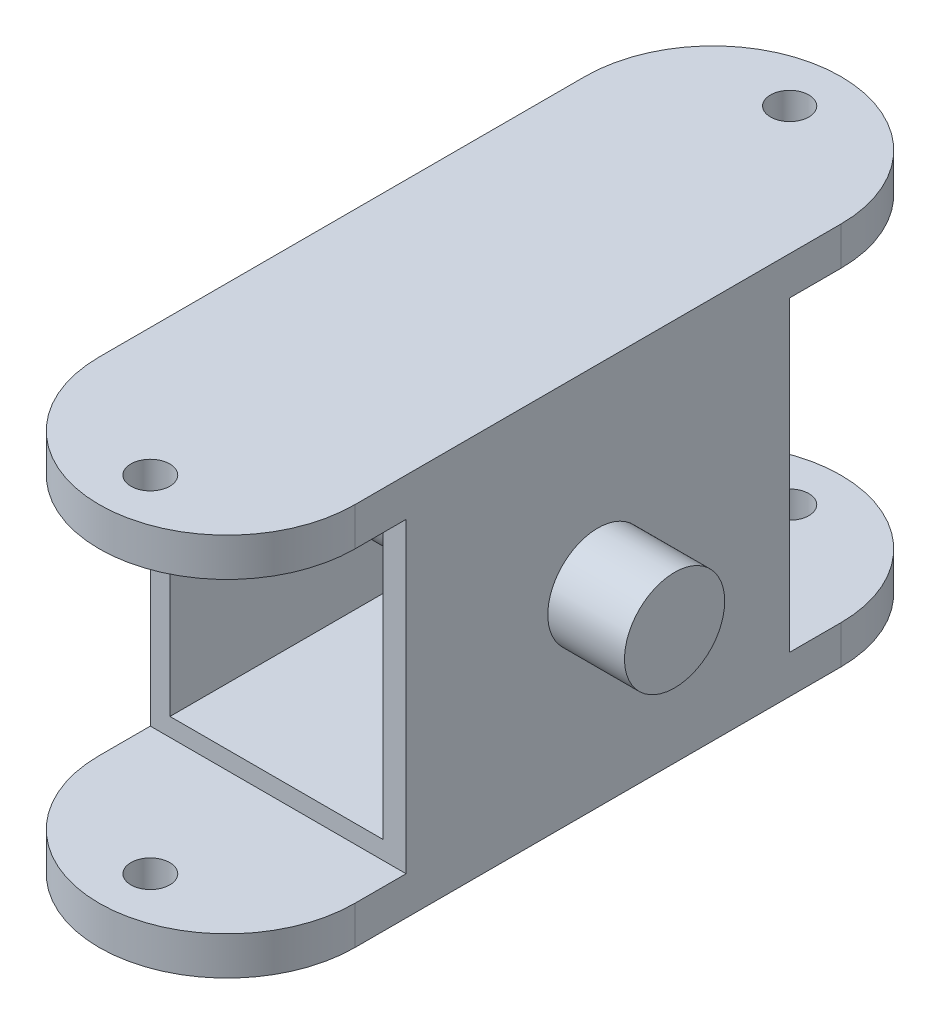
ISO-10303-21;
HEADER;
FILE_DESCRIPTION(('STEP AP214'),'2;1');
FILE_NAME('part.step','',(''),(''),'','','');
FILE_SCHEMA(('AUTOMOTIVE_DESIGN { 1 0 10303 214 1 1 1 1 }'));
ENDSEC;
DATA;
#1=APPLICATION_CONTEXT('core data for automotive mechanical design processes');
#2=APPLICATION_PROTOCOL_DEFINITION('international standard','automotive_design',2000,#1);
#3=PRODUCT_CONTEXT('',#1,'mechanical');
#4=PRODUCT('Part','Part','',(#3));
#5=PRODUCT_RELATED_PRODUCT_CATEGORY('part','',(#4));
#6=PRODUCT_DEFINITION_FORMATION('','',#4);
#7=PRODUCT_DEFINITION_CONTEXT('part definition',#1,'design');
#8=PRODUCT_DEFINITION('design','',#6,#7);
#9=PRODUCT_DEFINITION_SHAPE('','',#8);
#10=(LENGTH_UNIT() NAMED_UNIT(*) SI_UNIT(.MILLI.,.METRE.));
#11=(NAMED_UNIT(*) PLANE_ANGLE_UNIT() SI_UNIT($,.RADIAN.));
#12=(NAMED_UNIT(*) SI_UNIT($,.STERADIAN.) SOLID_ANGLE_UNIT());
#13=UNCERTAINTY_MEASURE_WITH_UNIT(LENGTH_MEASURE(1.E-05),#10,'distance_accuracy_value','');
#14=(GEOMETRIC_REPRESENTATION_CONTEXT(3) GLOBAL_UNCERTAINTY_ASSIGNED_CONTEXT((#13)) GLOBAL_UNIT_ASSIGNED_CONTEXT((#10,
#11,#12)) REPRESENTATION_CONTEXT('',''));
#15=CARTESIAN_POINT('',(0.,0.,0.));
#16=DIRECTION('',(0.,0.,1.));
#17=DIRECTION('',(1.,0.,0.));
#18=AXIS2_PLACEMENT_3D('',#15,#16,#17);
#19=CARTESIAN_POINT('',(0.,-7.5,-7.5));
#20=DIRECTION('',(0.,1.,0.));
#21=DIRECTION('',(0.,0.,1.));
#22=AXIS2_PLACEMENT_3D('',#19,#20,#21);
#23=PLANE('',#22);
#24=DIRECTION('',(0.,0.,-1.));
#25=VECTOR('',#24,1.);
#26=CARTESIAN_POINT('',(10.,-7.5,0.));
#27=LINE('',#26,#25);
#28=CARTESIAN_POINT('',(10.,-7.5,9.5));
#29=VERTEX_POINT('',#28);
#30=CARTESIAN_POINT('',(10.,-7.5,-9.5));
#31=VERTEX_POINT('',#30);
#32=EDGE_CURVE('E41',#29,#31,#27,.T.);
#33=ORIENTED_EDGE('',*,*,#32,.F.);
#34=CARTESIAN_POINT('',(5.,-7.5,9.5));
#35=DIRECTION('',(0.,1.,0.));
#36=DIRECTION('',(0.,0.,-1.));
#37=AXIS2_PLACEMENT_3D('',#34,#35,#36);
#38=CIRCLE('',#37,5.);
#39=CARTESIAN_POINT('',(0.,-7.5,9.5));
#40=VERTEX_POINT('',#39);
#41=EDGE_CURVE('E213',#40,#29,#38,.T.);
#42=ORIENTED_EDGE('',*,*,#41,.F.);
#43=DIRECTION('',(0.,0.,-1.));
#44=VECTOR('',#43,1.);
#45=CARTESIAN_POINT('',(0.,-7.5,0.));
#46=LINE('',#45,#44);
#47=CARTESIAN_POINT('',(0.,-7.5,-9.5));
#48=VERTEX_POINT('',#47);
#49=EDGE_CURVE('E184',#40,#48,#46,.T.);
#50=ORIENTED_EDGE('',*,*,#49,.T.);
#51=CARTESIAN_POINT('',(5.,-7.5,-9.5));
#52=DIRECTION('',(0.,1.,0.));
#53=DIRECTION('',(0.,0.,1.));
#54=AXIS2_PLACEMENT_3D('',#51,#52,#53);
#55=CIRCLE('',#54,5.);
#56=EDGE_CURVE('E246',#31,#48,#55,.T.);
#57=ORIENTED_EDGE('',*,*,#56,.F.);
#58=EDGE_LOOP('',(#33,#42,#50,#57));
#59=FACE_BOUND('',#58,.T.);
#60=CARTESIAN_POINT('',(5.,-7.5,12.5));
#61=DIRECTION('',(0.,1.,0.));
#62=DIRECTION('',(0.,0.,1.));
#63=AXIS2_PLACEMENT_3D('',#60,#61,#62);
#64=CIRCLE('',#63,0.759232067100159);
#65=CARTESIAN_POINT('',(5.,-7.5,13.2592320671002));
#66=VERTEX_POINT('',#65);
#67=EDGE_CURVE('E233',#66,#66,#64,.T.);
#68=ORIENTED_EDGE('',*,*,#67,.T.);
#69=EDGE_LOOP('',(#68));
#70=FACE_BOUND('',#69,.T.);
#71=CARTESIAN_POINT('',(5.,-7.5,-12.5));
#72=DIRECTION('',(0.,1.,0.));
#73=DIRECTION('',(0.,0.,1.));
#74=AXIS2_PLACEMENT_3D('',#71,#72,#73);
#75=CIRCLE('',#74,0.75);
#76=CARTESIAN_POINT('',(5.,-7.5,-11.75));
#77=VERTEX_POINT('',#76);
#78=EDGE_CURVE('E241',#77,#77,#75,.T.);
#79=ORIENTED_EDGE('',*,*,#78,.T.);
#80=EDGE_LOOP('',(#79));
#81=FACE_BOUND('',#80,.T.);
#82=ADVANCED_FACE('F33',(#59,#70,#81),#23,.F.);
#83=CARTESIAN_POINT('',(0.,-6.,-7.5));
#84=DIRECTION('',(0.,0.,-1.));
#85=DIRECTION('',(-1.,0.,0.));
#86=AXIS2_PLACEMENT_3D('',#83,#84,#85);
#87=PLANE('',#86);
#88=DIRECTION('',(0.,1.,0.));
#89=VECTOR('',#88,1.);
#90=CARTESIAN_POINT('',(0.768778211096725,-6.,-7.5));
#91=LINE('',#90,#89);
#92=CARTESIAN_POINT('',(0.768778211096725,-5.28902723612904,-7.5));
#93=VERTEX_POINT('',#92);
#94=CARTESIAN_POINT('',(0.768778211096725,5.26384139214758,-7.5));
#95=VERTEX_POINT('',#94);
#96=EDGE_CURVE('E179',#93,#95,#91,.T.);
#97=ORIENTED_EDGE('',*,*,#96,.F.);
#98=DIRECTION('',(-1.,0.,0.));
#99=VECTOR('',#98,1.);
#100=CARTESIAN_POINT('',(0.,-5.28902723612904,-7.5));
#101=LINE('',#100,#99);
#102=CARTESIAN_POINT('',(9.10529256899544,-5.28902723612904,-7.5));
#103=VERTEX_POINT('',#102);
#104=EDGE_CURVE('E172',#103,#93,#101,.T.);
#105=ORIENTED_EDGE('',*,*,#104,.F.);
#106=DIRECTION('',(0.,-1.,0.));
#107=VECTOR('',#106,1.);
#108=CARTESIAN_POINT('',(9.10529256899544,-6.,-7.5));
#109=LINE('',#108,#107);
#110=CARTESIAN_POINT('',(9.10529256899544,5.26384139214758,-7.5));
#111=VERTEX_POINT('',#110);
#112=EDGE_CURVE('E152',#111,#103,#109,.T.);
#113=ORIENTED_EDGE('',*,*,#112,.F.);
#114=DIRECTION('',(1.,0.,0.));
#115=VECTOR('',#114,1.);
#116=CARTESIAN_POINT('',(0.,5.26384139214758,-7.5));
#117=LINE('',#116,#115);
#118=EDGE_CURVE('E177',#95,#111,#117,.T.);
#119=ORIENTED_EDGE('',*,*,#118,.F.);
#120=EDGE_LOOP('',(#97,#105,#113,#119));
#121=FACE_BOUND('',#120,.T.);
#122=DIRECTION('',(0.,1.,0.));
#123=VECTOR('',#122,1.);
#124=CARTESIAN_POINT('',(10.,0.,-7.5));
#125=LINE('',#124,#123);
#126=CARTESIAN_POINT('',(10.,-6.,-7.5));
#127=VERTEX_POINT('',#126);
#128=CARTESIAN_POINT('',(10.,6.,-7.5));
#129=VERTEX_POINT('',#128);
#130=EDGE_CURVE('E183',#127,#129,#125,.T.);
#131=ORIENTED_EDGE('',*,*,#130,.F.);
#132=DIRECTION('',(1.,0.,0.));
#133=VECTOR('',#132,1.);
#134=CARTESIAN_POINT('',(5.,-6.,-7.5));
#135=LINE('',#134,#133);
#136=CARTESIAN_POINT('',(0.,-6.,-7.5));
#137=VERTEX_POINT('',#136);
#138=EDGE_CURVE('E191',#137,#127,#135,.T.);
#139=ORIENTED_EDGE('',*,*,#138,.F.);
#140=DIRECTION('',(0.,1.,0.));
#141=VECTOR('',#140,1.);
#142=CARTESIAN_POINT('',(0.,0.,-7.5));
#143=LINE('',#142,#141);
#144=CARTESIAN_POINT('',(0.,6.,-7.5));
#145=VERTEX_POINT('',#144);
#146=EDGE_CURVE('E196',#137,#145,#143,.T.);
#147=ORIENTED_EDGE('',*,*,#146,.T.);
#148=DIRECTION('',(1.,0.,0.));
#149=VECTOR('',#148,1.);
#150=CARTESIAN_POINT('',(5.,6.,-7.5));
#151=LINE('',#150,#149);
#152=EDGE_CURVE('E192',#145,#129,#151,.T.);
#153=ORIENTED_EDGE('',*,*,#152,.T.);
#154=EDGE_LOOP('',(#131,#139,#147,#153));
#155=FACE_BOUND('',#154,.T.);
#156=ADVANCED_FACE('F331',(#121,#155),#87,.T.);
#157=CARTESIAN_POINT('',(0.,7.5,-7.5));
#158=DIRECTION('',(0.,-1.,0.));
#159=DIRECTION('',(0.,0.,-1.));
#160=AXIS2_PLACEMENT_3D('',#157,#158,#159);
#161=PLANE('',#160);
#162=DIRECTION('',(0.,0.,1.));
#163=VECTOR('',#162,1.);
#164=CARTESIAN_POINT('',(10.,7.5,0.));
#165=LINE('',#164,#163);
#166=CARTESIAN_POINT('',(10.,7.5,-9.5));
#167=VERTEX_POINT('',#166);
#168=CARTESIAN_POINT('',(10.,7.5,9.5));
#169=VERTEX_POINT('',#168);
#170=EDGE_CURVE('E201',#167,#169,#165,.T.);
#171=ORIENTED_EDGE('',*,*,#170,.F.);
#172=CARTESIAN_POINT('',(5.,7.49999999999999,-9.5));
#173=DIRECTION('',(0.,-1.,0.));
#174=DIRECTION('',(0.,0.,1.));
#175=AXIS2_PLACEMENT_3D('',#172,#173,#174);
#176=CIRCLE('',#175,5.);
#177=CARTESIAN_POINT('',(0.,7.5,-9.5));
#178=VERTEX_POINT('',#177);
#179=EDGE_CURVE('E230',#178,#167,#176,.T.);
#180=ORIENTED_EDGE('',*,*,#179,.F.);
#181=DIRECTION('',(0.,0.,1.));
#182=VECTOR('',#181,1.);
#183=CARTESIAN_POINT('',(0.,7.5,0.));
#184=LINE('',#183,#182);
#185=CARTESIAN_POINT('',(0.,7.5,9.5));
#186=VERTEX_POINT('',#185);
#187=EDGE_CURVE('E204',#178,#186,#184,.T.);
#188=ORIENTED_EDGE('',*,*,#187,.T.);
#189=CARTESIAN_POINT('',(5.,7.50000000000001,9.5));
#190=DIRECTION('',(0.,-1.,0.));
#191=DIRECTION('',(0.,0.,-1.));
#192=AXIS2_PLACEMENT_3D('',#189,#190,#191);
#193=CIRCLE('',#192,5.);
#194=EDGE_CURVE('E224',#169,#186,#193,.T.);
#195=ORIENTED_EDGE('',*,*,#194,.F.);
#196=EDGE_LOOP('',(#171,#180,#188,#195));
#197=FACE_BOUND('',#196,.T.);
#198=CARTESIAN_POINT('',(5.,7.5,-12.5));
#199=DIRECTION('',(0.,1.,0.));
#200=DIRECTION('',(0.,0.,1.));
#201=AXIS2_PLACEMENT_3D('',#198,#199,#200);
#202=CIRCLE('',#201,0.75);
#203=CARTESIAN_POINT('',(5.,7.5,-11.75));
#204=VERTEX_POINT('',#203);
#205=EDGE_CURVE('E194',#204,#204,#202,.T.);
#206=ORIENTED_EDGE('',*,*,#205,.F.);
#207=EDGE_LOOP('',(#206));
#208=FACE_BOUND('',#207,.T.);
#209=CARTESIAN_POINT('',(5.,7.5,12.5));
#210=DIRECTION('',(0.,1.,0.));
#211=DIRECTION('',(0.,0.,1.));
#212=AXIS2_PLACEMENT_3D('',#209,#210,#211);
#213=CIRCLE('',#212,0.759232067100159);
#214=CARTESIAN_POINT('',(5.,7.5,13.2592320671002));
#215=VERTEX_POINT('',#214);
#216=EDGE_CURVE('E221',#215,#215,#213,.T.);
#217=ORIENTED_EDGE('',*,*,#216,.F.);
#218=EDGE_LOOP('',(#217));
#219=FACE_BOUND('',#218,.T.);
#220=ADVANCED_FACE('F315',(#197,#208,#219),#161,.F.);
#221=CARTESIAN_POINT('',(0.,-6.,7.5));
#222=DIRECTION('',(0.,0.,-1.));
#223=DIRECTION('',(-1.,0.,0.));
#224=AXIS2_PLACEMENT_3D('',#221,#222,#223);
#225=PLANE('',#224);
#226=DIRECTION('',(1.,0.,0.));
#227=VECTOR('',#226,1.);
#228=CARTESIAN_POINT('',(0.768778211096725,-5.28902723612904,7.5));
#229=LINE('',#228,#227);
#230=CARTESIAN_POINT('',(0.768778211096725,-5.28902723612904,7.5));
#231=VERTEX_POINT('',#230);
#232=CARTESIAN_POINT('',(9.10529256899544,-5.28902723612904,7.5));
#233=VERTEX_POINT('',#232);
#234=EDGE_CURVE('E158',#231,#233,#229,.T.);
#235=ORIENTED_EDGE('',*,*,#234,.F.);
#236=DIRECTION('',(0.,-1.,0.));
#237=VECTOR('',#236,1.);
#238=CARTESIAN_POINT('',(0.768778211096725,5.26384139214758,7.5));
#239=LINE('',#238,#237);
#240=CARTESIAN_POINT('',(0.768778211096725,5.26384139214758,7.5));
#241=VERTEX_POINT('',#240);
#242=EDGE_CURVE('E56',#241,#231,#239,.T.);
#243=ORIENTED_EDGE('',*,*,#242,.F.);
#244=DIRECTION('',(-1.,0.,0.));
#245=VECTOR('',#244,1.);
#246=CARTESIAN_POINT('',(0.768778211096725,5.26384139214758,7.5));
#247=LINE('',#246,#245);
#248=CARTESIAN_POINT('',(9.10529256899544,5.26384139214758,7.5));
#249=VERTEX_POINT('',#248);
#250=EDGE_CURVE('E165',#249,#241,#247,.T.);
#251=ORIENTED_EDGE('',*,*,#250,.F.);
#252=DIRECTION('',(0.,1.,0.));
#253=VECTOR('',#252,1.);
#254=CARTESIAN_POINT('',(9.10529256899544,5.26384139214758,7.5));
#255=LINE('',#254,#253);
#256=EDGE_CURVE('E149',#233,#249,#255,.T.);
#257=ORIENTED_EDGE('',*,*,#256,.F.);
#258=EDGE_LOOP('',(#235,#243,#251,#257));
#259=FACE_BOUND('',#258,.T.);
#260=DIRECTION('',(0.,-1.,0.));
#261=VECTOR('',#260,1.);
#262=CARTESIAN_POINT('',(10.,0.,7.5));
#263=LINE('',#262,#261);
#264=CARTESIAN_POINT('',(10.,6.,7.5));
#265=VERTEX_POINT('',#264);
#266=CARTESIAN_POINT('',(10.,-6.,7.5));
#267=VERTEX_POINT('',#266);
#268=EDGE_CURVE('E203',#265,#267,#263,.T.);
#269=ORIENTED_EDGE('',*,*,#268,.F.);
#270=DIRECTION('',(1.,0.,0.));
#271=VECTOR('',#270,1.);
#272=CARTESIAN_POINT('',(5.,6.,7.5));
#273=LINE('',#272,#271);
#274=CARTESIAN_POINT('',(0.,6.,7.5));
#275=VERTEX_POINT('',#274);
#276=EDGE_CURVE('E210',#275,#265,#273,.T.);
#277=ORIENTED_EDGE('',*,*,#276,.F.);
#278=DIRECTION('',(0.,-1.,0.));
#279=VECTOR('',#278,1.);
#280=CARTESIAN_POINT('',(0.,0.,7.5));
#281=LINE('',#280,#279);
#282=CARTESIAN_POINT('',(0.,-6.,7.5));
#283=VERTEX_POINT('',#282);
#284=EDGE_CURVE('E215',#275,#283,#281,.T.);
#285=ORIENTED_EDGE('',*,*,#284,.T.);
#286=DIRECTION('',(1.,0.,0.));
#287=VECTOR('',#286,1.);
#288=CARTESIAN_POINT('',(5.,-6.,7.5));
#289=LINE('',#288,#287);
#290=EDGE_CURVE('E211',#283,#267,#289,.T.);
#291=ORIENTED_EDGE('',*,*,#290,.T.);
#292=EDGE_LOOP('',(#269,#277,#285,#291));
#293=FACE_BOUND('',#292,.T.);
#294=ADVANCED_FACE('F162',(#259,#293),#225,.F.);
#295=CARTESIAN_POINT('',(5.,-2.5,12.5));
#296=DIRECTION('',(0.,1.,0.));
#297=DIRECTION('',(0.,0.,1.));
#298=AXIS2_PLACEMENT_3D('',#295,#296,#297);
#299=CYLINDRICAL_SURFACE('',#298,0.759232067100159);
#300=CARTESIAN_POINT('',(5.,6.,12.5));
#301=DIRECTION('',(0.,1.,0.));
#302=DIRECTION('',(0.,0.,1.));
#303=AXIS2_PLACEMENT_3D('',#300,#301,#302);
#304=CIRCLE('',#303,0.759232067100159);
#305=CARTESIAN_POINT('',(5.,6.,13.2592320671002));
#306=VERTEX_POINT('',#305);
#307=EDGE_CURVE('E220',#306,#306,#304,.T.);
#308=ORIENTED_EDGE('',*,*,#307,.F.);
#309=EDGE_LOOP('',(#308));
#310=FACE_BOUND('',#309,.T.);
#311=ORIENTED_EDGE('',*,*,#216,.T.);
#312=EDGE_LOOP('',(#311));
#313=FACE_BOUND('',#312,.T.);
#314=ADVANCED_FACE('F353',(#310,#313),#299,.F.);
#315=CARTESIAN_POINT('',(5.,-2.5,-12.5));
#316=DIRECTION('',(0.,1.,0.));
#317=DIRECTION('',(0.,0.,1.));
#318=AXIS2_PLACEMENT_3D('',#315,#316,#317);
#319=CYLINDRICAL_SURFACE('',#318,0.75);
#320=CARTESIAN_POINT('',(5.,6.,-12.5));
#321=DIRECTION('',(0.,1.,0.));
#322=DIRECTION('',(0.,0.,1.));
#323=AXIS2_PLACEMENT_3D('',#320,#321,#322);
#324=CIRCLE('',#323,0.75);
#325=CARTESIAN_POINT('',(5.,6.,-11.75));
#326=VERTEX_POINT('',#325);
#327=EDGE_CURVE('E227',#326,#326,#324,.T.);
#328=ORIENTED_EDGE('',*,*,#327,.F.);
#329=EDGE_LOOP('',(#328));
#330=FACE_BOUND('',#329,.T.);
#331=ORIENTED_EDGE('',*,*,#205,.T.);
#332=EDGE_LOOP('',(#331));
#333=FACE_BOUND('',#332,.T.);
#334=ADVANCED_FACE('F359',(#330,#333),#319,.F.);
#335=CARTESIAN_POINT('',(5.,-2.5,12.5));
#336=DIRECTION('',(0.,1.,0.));
#337=DIRECTION('',(0.,0.,1.));
#338=AXIS2_PLACEMENT_3D('',#335,#336,#337);
#339=CYLINDRICAL_SURFACE('',#338,0.759232067100159);
#340=ORIENTED_EDGE('',*,*,#67,.F.);
#341=EDGE_LOOP('',(#340));
#342=FACE_BOUND('',#341,.T.);
#343=CARTESIAN_POINT('',(5.,-6.,12.5));
#344=DIRECTION('',(0.,1.,0.));
#345=DIRECTION('',(0.,0.,1.));
#346=AXIS2_PLACEMENT_3D('',#343,#344,#345);
#347=CIRCLE('',#346,0.759232067100159);
#348=CARTESIAN_POINT('',(5.,-6.,13.2592320671002));
#349=VERTEX_POINT('',#348);
#350=EDGE_CURVE('E234',#349,#349,#347,.T.);
#351=ORIENTED_EDGE('',*,*,#350,.T.);
#352=EDGE_LOOP('',(#351));
#353=FACE_BOUND('',#352,.T.);
#354=ADVANCED_FACE('F527',(#342,#353),#339,.F.);
#355=CARTESIAN_POINT('',(5.,-2.5,-12.5));
#356=DIRECTION('',(0.,1.,0.));
#357=DIRECTION('',(0.,0.,1.));
#358=AXIS2_PLACEMENT_3D('',#355,#356,#357);
#359=CYLINDRICAL_SURFACE('',#358,0.75);
#360=ORIENTED_EDGE('',*,*,#78,.F.);
#361=EDGE_LOOP('',(#360));
#362=FACE_BOUND('',#361,.T.);
#363=CARTESIAN_POINT('',(5.,-6.,-12.5));
#364=DIRECTION('',(0.,1.,0.));
#365=DIRECTION('',(0.,0.,1.));
#366=AXIS2_PLACEMENT_3D('',#363,#364,#365);
#367=CIRCLE('',#366,0.75);
#368=CARTESIAN_POINT('',(5.,-6.,-11.75));
#369=VERTEX_POINT('',#368);
#370=EDGE_CURVE('E242',#369,#369,#367,.T.);
#371=ORIENTED_EDGE('',*,*,#370,.T.);
#372=EDGE_LOOP('',(#371));
#373=FACE_BOUND('',#372,.T.);
#374=ADVANCED_FACE('F537',(#362,#373),#359,.F.);
#375=CARTESIAN_POINT('',(5.,0.,-9.5));
#376=DIRECTION('',(0.,1.,0.));
#377=DIRECTION('',(0.,0.,1.));
#378=AXIS2_PLACEMENT_3D('',#375,#376,#377);
#379=CYLINDRICAL_SURFACE('',#378,5.);
#380=CARTESIAN_POINT('',(5.,-6.,-9.5));
#381=DIRECTION('',(0.,-1.,0.));
#382=DIRECTION('',(0.,0.,1.));
#383=AXIS2_PLACEMENT_3D('',#380,#381,#382);
#384=CIRCLE('',#383,5.);
#385=CARTESIAN_POINT('',(0.,-6.,-9.5));
#386=VERTEX_POINT('',#385);
#387=CARTESIAN_POINT('',(10.,-6.,-9.5));
#388=VERTEX_POINT('',#387);
#389=EDGE_CURVE('E254',#386,#388,#384,.T.);
#390=ORIENTED_EDGE('',*,*,#389,.T.);
#391=DIRECTION('',(0.,1.,0.));
#392=VECTOR('',#391,1.);
#393=CARTESIAN_POINT('',(10.,0.,-9.5));
#394=LINE('',#393,#392);
#395=EDGE_CURVE('E249',#31,#388,#394,.T.);
#396=ORIENTED_EDGE('',*,*,#395,.F.);
#397=ORIENTED_EDGE('',*,*,#56,.T.);
#398=DIRECTION('',(0.,1.,0.));
#399=VECTOR('',#398,1.);
#400=CARTESIAN_POINT('',(0.,0.,-9.5));
#401=LINE('',#400,#399);
#402=EDGE_CURVE('E188',#48,#386,#401,.T.);
#403=ORIENTED_EDGE('',*,*,#402,.T.);
#404=EDGE_LOOP('',(#390,#396,#397,#403));
#405=FACE_BOUND('',#404,.T.);
#406=ADVANCED_FACE('F338',(#405),#379,.T.);
#407=CARTESIAN_POINT('',(5.,0.,-9.5));
#408=DIRECTION('',(0.,1.,0.));
#409=DIRECTION('',(0.,0.,1.));
#410=AXIS2_PLACEMENT_3D('',#407,#408,#409);
#411=CYLINDRICAL_SURFACE('',#410,5.);
#412=ORIENTED_EDGE('',*,*,#179,.T.);
#413=DIRECTION('',(0.,1.,0.));
#414=VECTOR('',#413,1.);
#415=CARTESIAN_POINT('',(10.,0.,-9.5));
#416=LINE('',#415,#414);
#417=CARTESIAN_POINT('',(10.,6.,-9.5));
#418=VERTEX_POINT('',#417);
#419=EDGE_CURVE('E253',#418,#167,#416,.T.);
#420=ORIENTED_EDGE('',*,*,#419,.F.);
#421=CARTESIAN_POINT('',(5.,5.99999999999999,-9.5));
#422=DIRECTION('',(0.,1.,0.));
#423=DIRECTION('',(0.,0.,1.));
#424=AXIS2_PLACEMENT_3D('',#421,#422,#423);
#425=CIRCLE('',#424,5.);
#426=CARTESIAN_POINT('',(0.,6.,-9.5));
#427=VERTEX_POINT('',#426);
#428=EDGE_CURVE('E256',#418,#427,#425,.T.);
#429=ORIENTED_EDGE('',*,*,#428,.T.);
#430=DIRECTION('',(0.,1.,0.));
#431=VECTOR('',#430,1.);
#432=CARTESIAN_POINT('',(0.,0.,-9.5));
#433=LINE('',#432,#431);
#434=EDGE_CURVE('E207',#427,#178,#433,.T.);
#435=ORIENTED_EDGE('',*,*,#434,.T.);
#436=EDGE_LOOP('',(#412,#420,#429,#435));
#437=FACE_BOUND('',#436,.T.);
#438=ADVANCED_FACE('F319',(#437),#411,.T.);
#439=CARTESIAN_POINT('',(0.,-6.,-14.5));
#440=DIRECTION('',(0.,1.,0.));
#441=DIRECTION('',(0.,0.,1.));
#442=AXIS2_PLACEMENT_3D('',#439,#440,#441);
#443=PLANE('',#442);
#444=DIRECTION('',(0.,0.,1.));
#445=VECTOR('',#444,1.);
#446=CARTESIAN_POINT('',(0.,-6.,-8.5));
#447=LINE('',#446,#445);
#448=EDGE_CURVE('E198',#386,#137,#447,.T.);
#449=ORIENTED_EDGE('',*,*,#448,.T.);
#450=ORIENTED_EDGE('',*,*,#138,.T.);
#451=DIRECTION('',(0.,0.,1.));
#452=VECTOR('',#451,1.);
#453=CARTESIAN_POINT('',(10.,-6.,-8.5));
#454=LINE('',#453,#452);
#455=EDGE_CURVE('E245',#388,#127,#454,.T.);
#456=ORIENTED_EDGE('',*,*,#455,.F.);
#457=ORIENTED_EDGE('',*,*,#389,.F.);
#458=EDGE_LOOP('',(#449,#450,#456,#457));
#459=FACE_BOUND('',#458,.T.);
#460=ORIENTED_EDGE('',*,*,#370,.F.);
#461=EDGE_LOOP('',(#460));
#462=FACE_BOUND('',#461,.T.);
#463=ADVANCED_FACE('F334',(#459,#462),#443,.T.);
#464=CARTESIAN_POINT('',(0.,6.,-14.5));
#465=DIRECTION('',(0.,1.,0.));
#466=DIRECTION('',(0.,0.,1.));
#467=AXIS2_PLACEMENT_3D('',#464,#465,#466);
#468=PLANE('',#467);
#469=DIRECTION('',(0.,0.,-1.));
#470=VECTOR('',#469,1.);
#471=CARTESIAN_POINT('',(0.,6.,-8.5));
#472=LINE('',#471,#470);
#473=EDGE_CURVE('E199',#145,#427,#472,.T.);
#474=ORIENTED_EDGE('',*,*,#473,.T.);
#475=ORIENTED_EDGE('',*,*,#428,.F.);
#476=DIRECTION('',(0.,0.,-1.));
#477=VECTOR('',#476,1.);
#478=CARTESIAN_POINT('',(10.,6.,-8.5));
#479=LINE('',#478,#477);
#480=EDGE_CURVE('E195',#129,#418,#479,.T.);
#481=ORIENTED_EDGE('',*,*,#480,.F.);
#482=ORIENTED_EDGE('',*,*,#152,.F.);
#483=EDGE_LOOP('',(#474,#475,#481,#482));
#484=FACE_BOUND('',#483,.T.);
#485=ORIENTED_EDGE('',*,*,#327,.T.);
#486=EDGE_LOOP('',(#485));
#487=FACE_BOUND('',#486,.T.);
#488=ADVANCED_FACE('F324',(#484,#487),#468,.F.);
#489=CARTESIAN_POINT('',(5.,0.,9.5));
#490=DIRECTION('',(0.,-1.,0.));
#491=DIRECTION('',(0.,0.,-1.));
#492=AXIS2_PLACEMENT_3D('',#489,#490,#491);
#493=CYLINDRICAL_SURFACE('',#492,5.);
#494=ORIENTED_EDGE('',*,*,#41,.T.);
#495=DIRECTION('',(0.,-1.,0.));
#496=VECTOR('',#495,1.);
#497=CARTESIAN_POINT('',(10.,0.,9.5));
#498=LINE('',#497,#496);
#499=CARTESIAN_POINT('',(10.,-6.,9.5));
#500=VERTEX_POINT('',#499);
#501=EDGE_CURVE('E258',#500,#29,#498,.T.);
#502=ORIENTED_EDGE('',*,*,#501,.F.);
#503=CARTESIAN_POINT('',(5.,-6.,9.5));
#504=DIRECTION('',(0.,-1.,0.));
#505=DIRECTION('',(0.,0.,-1.));
#506=AXIS2_PLACEMENT_3D('',#503,#504,#505);
#507=CIRCLE('',#506,5.);
#508=CARTESIAN_POINT('',(0.,-6.,9.5));
#509=VERTEX_POINT('',#508);
#510=EDGE_CURVE('E237',#500,#509,#507,.T.);
#511=ORIENTED_EDGE('',*,*,#510,.T.);
#512=DIRECTION('',(0.,-1.,0.));
#513=VECTOR('',#512,1.);
#514=CARTESIAN_POINT('',(0.,0.,9.5));
#515=LINE('',#514,#513);
#516=EDGE_CURVE('E187',#509,#40,#515,.T.);
#517=ORIENTED_EDGE('',*,*,#516,.T.);
#518=EDGE_LOOP('',(#494,#502,#511,#517));
#519=FACE_BOUND('',#518,.T.);
#520=ADVANCED_FACE('F346',(#519),#493,.T.);
#521=CARTESIAN_POINT('',(10.,0.,0.));
#522=DIRECTION('',(1.,0.,0.));
#523=DIRECTION('',(0.,0.,-1.));
#524=AXIS2_PLACEMENT_3D('',#521,#522,#523);
#525=PLANE('',#524);
#526=CARTESIAN_POINT('',(10.,0.,0.));
#527=DIRECTION('',(1.,0.,0.));
#528=DIRECTION('',(0.,0.,-1.));
#529=AXIS2_PLACEMENT_3D('',#526,#527,#528);
#530=CIRCLE('',#529,1.95866409427285);
#531=CARTESIAN_POINT('',(10.,0.,-1.95866409427285));
#532=VERTEX_POINT('',#531);
#533=EDGE_CURVE('E403',#532,#532,#530,.T.);
#534=ORIENTED_EDGE('',*,*,#533,.F.);
#535=EDGE_LOOP('',(#534));
#536=FACE_BOUND('',#535,.T.);
#537=DIRECTION('',(0.,-1.,0.));
#538=VECTOR('',#537,1.);
#539=CARTESIAN_POINT('',(10.,6.75,9.5));
#540=LINE('',#539,#538);
#541=CARTESIAN_POINT('',(10.,6.,9.5));
#542=VERTEX_POINT('',#541);
#543=EDGE_CURVE('E278',#169,#542,#540,.T.);
#544=ORIENTED_EDGE('',*,*,#543,.T.);
#545=DIRECTION('',(0.,0.,-1.));
#546=VECTOR('',#545,1.);
#547=CARTESIAN_POINT('',(10.,6.,8.5));
#548=LINE('',#547,#546);
#549=EDGE_CURVE('E285',#542,#265,#548,.T.);
#550=ORIENTED_EDGE('',*,*,#549,.T.);
#551=ORIENTED_EDGE('',*,*,#268,.T.);
#552=DIRECTION('',(0.,0.,1.));
#553=VECTOR('',#552,1.);
#554=CARTESIAN_POINT('',(10.,-6.,8.5));
#555=LINE('',#554,#553);
#556=EDGE_CURVE('E214',#267,#500,#555,.T.);
#557=ORIENTED_EDGE('',*,*,#556,.T.);
#558=ORIENTED_EDGE('',*,*,#501,.T.);
#559=ORIENTED_EDGE('',*,*,#32,.T.);
#560=ORIENTED_EDGE('',*,*,#395,.T.);
#561=ORIENTED_EDGE('',*,*,#455,.T.);
#562=ORIENTED_EDGE('',*,*,#130,.T.);
#563=ORIENTED_EDGE('',*,*,#480,.T.);
#564=ORIENTED_EDGE('',*,*,#419,.T.);
#565=ORIENTED_EDGE('',*,*,#170,.T.);
#566=EDGE_LOOP('',(#544,#550,#551,#557,#558,#559,#560,#561,#562,#563,#564,#565));
#567=FACE_BOUND('',#566,.T.);
#568=ADVANCED_FACE('F313',(#536,#567),#525,.T.);
#569=CARTESIAN_POINT('',(5.,0.,9.5));
#570=DIRECTION('',(0.,-1.,0.));
#571=DIRECTION('',(0.,0.,-1.));
#572=AXIS2_PLACEMENT_3D('',#569,#570,#571);
#573=CYLINDRICAL_SURFACE('',#572,5.);
#574=CARTESIAN_POINT('',(5.,6.00000000000001,9.5));
#575=DIRECTION('',(0.,1.,0.));
#576=DIRECTION('',(0.,0.,-1.));
#577=AXIS2_PLACEMENT_3D('',#574,#575,#576);
#578=CIRCLE('',#577,5.);
#579=CARTESIAN_POINT('',(0.,6.,9.5));
#580=VERTEX_POINT('',#579);
#581=EDGE_CURVE('E238',#580,#542,#578,.T.);
#582=ORIENTED_EDGE('',*,*,#581,.T.);
#583=ORIENTED_EDGE('',*,*,#543,.F.);
#584=ORIENTED_EDGE('',*,*,#194,.T.);
#585=DIRECTION('',(0.,-1.,0.));
#586=VECTOR('',#585,1.);
#587=CARTESIAN_POINT('',(0.,6.75,9.5));
#588=LINE('',#587,#586);
#589=EDGE_CURVE('E181',#186,#580,#588,.T.);
#590=ORIENTED_EDGE('',*,*,#589,.T.);
#591=EDGE_LOOP('',(#582,#583,#584,#590));
#592=FACE_BOUND('',#591,.T.);
#593=ADVANCED_FACE('F299',(#592),#573,.T.);
#594=CARTESIAN_POINT('',(0.,-6.,-14.5));
#595=DIRECTION('',(0.,1.,0.));
#596=DIRECTION('',(0.,0.,1.));
#597=AXIS2_PLACEMENT_3D('',#594,#595,#596);
#598=PLANE('',#597);
#599=ORIENTED_EDGE('',*,*,#510,.F.);
#600=ORIENTED_EDGE('',*,*,#556,.F.);
#601=ORIENTED_EDGE('',*,*,#290,.F.);
#602=DIRECTION('',(0.,0.,1.));
#603=VECTOR('',#602,1.);
#604=CARTESIAN_POINT('',(0.,-6.,8.5));
#605=LINE('',#604,#603);
#606=EDGE_CURVE('E218',#283,#509,#605,.T.);
#607=ORIENTED_EDGE('',*,*,#606,.T.);
#608=EDGE_LOOP('',(#599,#600,#601,#607));
#609=FACE_BOUND('',#608,.T.);
#610=ORIENTED_EDGE('',*,*,#350,.F.);
#611=EDGE_LOOP('',(#610));
#612=FACE_BOUND('',#611,.T.);
#613=ADVANCED_FACE('F350',(#609,#612),#598,.T.);
#614=CARTESIAN_POINT('',(0.,6.,-14.5));
#615=DIRECTION('',(0.,1.,0.));
#616=DIRECTION('',(0.,0.,1.));
#617=AXIS2_PLACEMENT_3D('',#614,#615,#616);
#618=PLANE('',#617);
#619=ORIENTED_EDGE('',*,*,#581,.F.);
#620=DIRECTION('',(0.,0.,-1.));
#621=VECTOR('',#620,1.);
#622=CARTESIAN_POINT('',(0.,6.,8.5));
#623=LINE('',#622,#621);
#624=EDGE_CURVE('E217',#580,#275,#623,.T.);
#625=ORIENTED_EDGE('',*,*,#624,.T.);
#626=ORIENTED_EDGE('',*,*,#276,.T.);
#627=ORIENTED_EDGE('',*,*,#549,.F.);
#628=EDGE_LOOP('',(#619,#625,#626,#627));
#629=FACE_BOUND('',#628,.T.);
#630=ORIENTED_EDGE('',*,*,#307,.T.);
#631=EDGE_LOOP('',(#630));
#632=FACE_BOUND('',#631,.T.);
#633=ADVANCED_FACE('F309',(#629,#632),#618,.F.);
#634=CARTESIAN_POINT('',(0.,0.,0.));
#635=DIRECTION('',(1.,0.,0.));
#636=DIRECTION('',(0.,0.,-1.));
#637=AXIS2_PLACEMENT_3D('',#634,#635,#636);
#638=PLANE('',#637);
#639=ORIENTED_EDGE('',*,*,#624,.F.);
#640=ORIENTED_EDGE('',*,*,#589,.F.);
#641=ORIENTED_EDGE('',*,*,#187,.F.);
#642=ORIENTED_EDGE('',*,*,#434,.F.);
#643=ORIENTED_EDGE('',*,*,#473,.F.);
#644=ORIENTED_EDGE('',*,*,#146,.F.);
#645=ORIENTED_EDGE('',*,*,#448,.F.);
#646=ORIENTED_EDGE('',*,*,#402,.F.);
#647=ORIENTED_EDGE('',*,*,#49,.F.);
#648=ORIENTED_EDGE('',*,*,#516,.F.);
#649=ORIENTED_EDGE('',*,*,#606,.F.);
#650=ORIENTED_EDGE('',*,*,#284,.F.);
#651=EDGE_LOOP('',(#639,#640,#641,#642,#643,#644,#645,#646,#647,#648,#649,#650));
#652=FACE_BOUND('',#651,.T.);
#653=ADVANCED_FACE('F35',(#652),#638,.F.);
#654=CARTESIAN_POINT('',(0.768778211096725,5.26384139214758,-8.5));
#655=DIRECTION('',(-1.,0.,0.));
#656=DIRECTION('',(0.,0.,1.));
#657=AXIS2_PLACEMENT_3D('',#654,#655,#656);
#658=PLANE('',#657);
#659=CARTESIAN_POINT('',(0.768778211096725,0.,0.));
#660=DIRECTION('',(-1.,0.,0.));
#661=DIRECTION('',(0.,0.,1.));
#662=AXIS2_PLACEMENT_3D('',#659,#660,#661);
#663=CIRCLE('',#662,2.02385780965642);
#664=CARTESIAN_POINT('',(0.768778211096725,0.,2.02385780965642));
#665=VERTEX_POINT('',#664);
#666=EDGE_CURVE('E11',#665,#665,#663,.F.);
#667=ORIENTED_EDGE('',*,*,#666,.F.);
#668=EDGE_LOOP('',(#667));
#669=FACE_BOUND('',#668,.T.);
#670=ORIENTED_EDGE('',*,*,#96,.T.);
#671=DIRECTION('',(0.,0.,1.));
#672=VECTOR('',#671,1.);
#673=CARTESIAN_POINT('',(0.768778211096725,5.26384139214758,-8.5));
#674=LINE('',#673,#672);
#675=EDGE_CURVE('E170',#95,#241,#674,.T.);
#676=ORIENTED_EDGE('',*,*,#675,.T.);
#677=ORIENTED_EDGE('',*,*,#242,.T.);
#678=DIRECTION('',(0.,0.,1.));
#679=VECTOR('',#678,1.);
#680=CARTESIAN_POINT('',(0.768778211096725,-5.28902723612904,-8.5));
#681=LINE('',#680,#679);
#682=EDGE_CURVE('E155',#93,#231,#681,.T.);
#683=ORIENTED_EDGE('',*,*,#682,.F.);
#684=EDGE_LOOP('',(#670,#676,#677,#683));
#685=FACE_BOUND('',#684,.T.);
#686=ADVANCED_FACE('F371',(#669,#685),#658,.F.);
#687=CARTESIAN_POINT('',(0.768778211096725,5.26384139214758,-8.5));
#688=DIRECTION('',(0.,1.,0.));
#689=DIRECTION('',(0.,0.,1.));
#690=AXIS2_PLACEMENT_3D('',#687,#688,#689);
#691=PLANE('',#690);
#692=ORIENTED_EDGE('',*,*,#118,.T.);
#693=DIRECTION('',(0.,0.,1.));
#694=VECTOR('',#693,1.);
#695=CARTESIAN_POINT('',(9.10529256899544,5.26384139214758,-8.5));
#696=LINE('',#695,#694);
#697=EDGE_CURVE('E154',#111,#249,#696,.T.);
#698=ORIENTED_EDGE('',*,*,#697,.T.);
#699=ORIENTED_EDGE('',*,*,#250,.T.);
#700=ORIENTED_EDGE('',*,*,#675,.F.);
#701=EDGE_LOOP('',(#692,#698,#699,#700));
#702=FACE_BOUND('',#701,.T.);
#703=ADVANCED_FACE('F374',(#702),#691,.F.);
#704=CARTESIAN_POINT('',(9.10529256899544,5.26384139214758,-8.5));
#705=DIRECTION('',(1.,0.,0.));
#706=DIRECTION('',(0.,0.,-1.));
#707=AXIS2_PLACEMENT_3D('',#704,#705,#706);
#708=PLANE('',#707);
#709=ORIENTED_EDGE('',*,*,#112,.T.);
#710=DIRECTION('',(0.,0.,1.));
#711=VECTOR('',#710,1.);
#712=CARTESIAN_POINT('',(9.10529256899544,-5.28902723612904,-8.5));
#713=LINE('',#712,#711);
#714=EDGE_CURVE('E48',#103,#233,#713,.T.);
#715=ORIENTED_EDGE('',*,*,#714,.T.);
#716=ORIENTED_EDGE('',*,*,#256,.T.);
#717=ORIENTED_EDGE('',*,*,#697,.F.);
#718=EDGE_LOOP('',(#709,#715,#716,#717));
#719=FACE_BOUND('',#718,.T.);
#720=ADVANCED_FACE('F146',(#719),#708,.F.);
#721=CARTESIAN_POINT('',(0.768778211096725,-5.28902723612904,-8.5));
#722=DIRECTION('',(0.,-1.,0.));
#723=DIRECTION('',(0.,0.,-1.));
#724=AXIS2_PLACEMENT_3D('',#721,#722,#723);
#725=PLANE('',#724);
#726=ORIENTED_EDGE('',*,*,#104,.T.);
#727=ORIENTED_EDGE('',*,*,#682,.T.);
#728=ORIENTED_EDGE('',*,*,#234,.T.);
#729=ORIENTED_EDGE('',*,*,#714,.F.);
#730=EDGE_LOOP('',(#726,#727,#728,#729));
#731=FACE_BOUND('',#730,.T.);
#732=ADVANCED_FACE('F159',(#731),#725,.F.);
#733=CARTESIAN_POINT('',(13.,0.,0.));
#734=DIRECTION('',(-1.,0.,0.));
#735=DIRECTION('',(0.,0.,1.));
#736=AXIS2_PLACEMENT_3D('',#733,#734,#735);
#737=CYLINDRICAL_SURFACE('',#736,1.95866409427285);
#738=CARTESIAN_POINT('',(13.,0.,0.));
#739=DIRECTION('',(1.,0.,0.));
#740=DIRECTION('',(0.,0.,-1.));
#741=AXIS2_PLACEMENT_3D('',#738,#739,#740);
#742=CIRCLE('',#741,1.95866409427285);
#743=CARTESIAN_POINT('',(13.,0.,-1.95866409427285));
#744=VERTEX_POINT('',#743);
#745=EDGE_CURVE('E406',#744,#744,#742,.T.);
#746=ORIENTED_EDGE('',*,*,#745,.F.);
#747=EDGE_LOOP('',(#746));
#748=FACE_BOUND('',#747,.T.);
#749=ORIENTED_EDGE('',*,*,#533,.T.);
#750=EDGE_LOOP('',(#749));
#751=FACE_BOUND('',#750,.T.);
#752=ADVANCED_FACE('F378',(#748,#751),#737,.T.);
#753=CARTESIAN_POINT('',(13.,0.,0.));
#754=DIRECTION('',(1.,0.,0.));
#755=DIRECTION('',(0.,0.,-1.));
#756=AXIS2_PLACEMENT_3D('',#753,#754,#755);
#757=PLANE('',#756);
#758=ORIENTED_EDGE('',*,*,#745,.T.);
#759=EDGE_LOOP('',(#758));
#760=FACE_BOUND('',#759,.T.);
#761=ADVANCED_FACE('F386',(#760),#757,.T.);
#762=CARTESIAN_POINT('',(3.76877821109672,0.,0.));
#763=DIRECTION('',(-1.,0.,0.));
#764=DIRECTION('',(0.,0.,1.));
#765=AXIS2_PLACEMENT_3D('',#762,#763,#764);
#766=CYLINDRICAL_SURFACE('',#765,2.02385780965642);
#767=CARTESIAN_POINT('',(3.76877821109672,0.,0.));
#768=DIRECTION('',(1.,0.,0.));
#769=DIRECTION('',(0.,0.,-1.));
#770=AXIS2_PLACEMENT_3D('',#767,#768,#769);
#771=CIRCLE('',#770,2.02385780965642);
#772=CARTESIAN_POINT('',(3.76877821109672,0.,-2.02385780965642));
#773=VERTEX_POINT('',#772);
#774=EDGE_CURVE('E402',#773,#773,#771,.T.);
#775=ORIENTED_EDGE('',*,*,#774,.F.);
#776=EDGE_LOOP('',(#775));
#777=FACE_BOUND('',#776,.T.);
#778=ORIENTED_EDGE('',*,*,#666,.T.);
#779=EDGE_LOOP('',(#778));
#780=FACE_BOUND('',#779,.T.);
#781=ADVANCED_FACE('F390',(#777,#780),#766,.T.);
#782=CARTESIAN_POINT('',(3.76877821109672,0.,0.));
#783=DIRECTION('',(1.,0.,0.));
#784=DIRECTION('',(0.,0.,-1.));
#785=AXIS2_PLACEMENT_3D('',#782,#783,#784);
#786=PLANE('',#785);
#787=ORIENTED_EDGE('',*,*,#774,.T.);
#788=EDGE_LOOP('',(#787));
#789=FACE_BOUND('',#788,.T.);
#790=ADVANCED_FACE('F394',(#789),#786,.T.);
#791=CLOSED_SHELL('',(#82,#156,#220,#294,#314,#334,#354,#374,#406,#438,#463,#488,#520,#568,#593,
#613,#633,#653,#686,#703,#720,#732,#752,#761,#781,#790));
#792=MANIFOLD_SOLID_BREP('B2',#791);
#793=ADVANCED_BREP_SHAPE_REPRESENTATION('',(#18,#792),#14);
#794=SHAPE_DEFINITION_REPRESENTATION(#9,#793);
ENDSEC;
END-ISO-10303-21;
